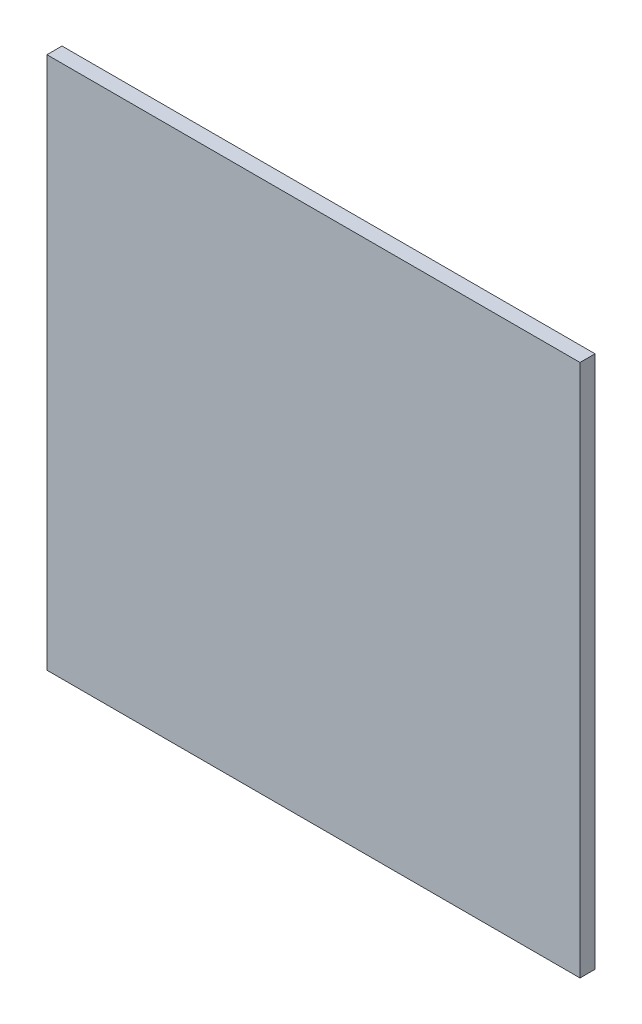
ISO-10303-21;
HEADER;
FILE_DESCRIPTION(('STEP AP214'),'2;1');
FILE_NAME('part.step','',(''),(''),'','','');
FILE_SCHEMA(('AUTOMOTIVE_DESIGN { 1 0 10303 214 1 1 1 1 }'));
ENDSEC;
DATA;
#1=APPLICATION_CONTEXT('core data for automotive mechanical design processes');
#2=APPLICATION_PROTOCOL_DEFINITION('international standard','automotive_design',2000,#1);
#3=PRODUCT_CONTEXT('',#1,'mechanical');
#4=PRODUCT('Part','Part','',(#3));
#5=PRODUCT_RELATED_PRODUCT_CATEGORY('part','',(#4));
#6=PRODUCT_DEFINITION_FORMATION('','',#4);
#7=PRODUCT_DEFINITION_CONTEXT('part definition',#1,'design');
#8=PRODUCT_DEFINITION('design','',#6,#7);
#9=PRODUCT_DEFINITION_SHAPE('','',#8);
#10=(LENGTH_UNIT() NAMED_UNIT(*) SI_UNIT(.MILLI.,.METRE.));
#11=(NAMED_UNIT(*) PLANE_ANGLE_UNIT() SI_UNIT($,.RADIAN.));
#12=(NAMED_UNIT(*) SI_UNIT($,.STERADIAN.) SOLID_ANGLE_UNIT());
#13=UNCERTAINTY_MEASURE_WITH_UNIT(LENGTH_MEASURE(1.E-05),#10,'distance_accuracy_value','');
#14=(GEOMETRIC_REPRESENTATION_CONTEXT(3) GLOBAL_UNCERTAINTY_ASSIGNED_CONTEXT((#13)) GLOBAL_UNIT_ASSIGNED_CONTEXT((#10,
#11,#12)) REPRESENTATION_CONTEXT('',''));
#15=CARTESIAN_POINT('',(0.,0.,0.));
#16=DIRECTION('',(0.,0.,1.));
#17=DIRECTION('',(1.,0.,0.));
#18=AXIS2_PLACEMENT_3D('',#15,#16,#17);
#19=CARTESIAN_POINT('',(-177.,177.,10.));
#20=DIRECTION('',(1.,0.,0.));
#21=DIRECTION('',(0.,1.,0.));
#22=AXIS2_PLACEMENT_3D('',#19,#20,#21);
#23=PLANE('',#22);
#24=DIRECTION('',(0.,-1.,0.));
#25=VECTOR('',#24,1.);
#26=CARTESIAN_POINT('',(-177.,177.,0.));
#27=LINE('',#26,#25);
#28=CARTESIAN_POINT('',(-177.,177.,0.));
#29=VERTEX_POINT('',#28);
#30=CARTESIAN_POINT('',(-177.,-177.,0.));
#31=VERTEX_POINT('',#30);
#32=EDGE_CURVE('E94',#29,#31,#27,.T.);
#33=ORIENTED_EDGE('',*,*,#32,.T.);
#34=DIRECTION('',(0.,0.,-1.));
#35=VECTOR('',#34,1.);
#36=CARTESIAN_POINT('',(-177.,-177.,10.));
#37=LINE('',#36,#35);
#38=CARTESIAN_POINT('',(-177.,-177.,10.));
#39=VERTEX_POINT('',#38);
#40=EDGE_CURVE('E11',#39,#31,#37,.T.);
#41=ORIENTED_EDGE('',*,*,#40,.F.);
#42=DIRECTION('',(0.,-1.,0.));
#43=VECTOR('',#42,1.);
#44=CARTESIAN_POINT('',(-177.,177.,10.));
#45=LINE('',#44,#43);
#46=CARTESIAN_POINT('',(-177.,177.,10.));
#47=VERTEX_POINT('',#46);
#48=EDGE_CURVE('E82',#47,#39,#45,.T.);
#49=ORIENTED_EDGE('',*,*,#48,.F.);
#50=DIRECTION('',(0.,0.,-1.));
#51=VECTOR('',#50,1.);
#52=CARTESIAN_POINT('',(-177.,177.,10.));
#53=LINE('',#52,#51);
#54=EDGE_CURVE('E90',#47,#29,#53,.T.);
#55=ORIENTED_EDGE('',*,*,#54,.T.);
#56=EDGE_LOOP('',(#33,#41,#49,#55));
#57=FACE_BOUND('',#56,.T.);
#58=ADVANCED_FACE('F31',(#57),#23,.F.);
#59=CARTESIAN_POINT('',(-177.,-177.,10.));
#60=DIRECTION('',(0.,1.,0.));
#61=DIRECTION('',(0.,0.,1.));
#62=AXIS2_PLACEMENT_3D('',#59,#60,#61);
#63=PLANE('',#62);
#64=DIRECTION('',(1.,0.,0.));
#65=VECTOR('',#64,1.);
#66=CARTESIAN_POINT('',(-177.,-177.,0.));
#67=LINE('',#66,#65);
#68=CARTESIAN_POINT('',(177.,-177.,0.));
#69=VERTEX_POINT('',#68);
#70=EDGE_CURVE('E86',#31,#69,#67,.T.);
#71=ORIENTED_EDGE('',*,*,#70,.T.);
#72=DIRECTION('',(0.,0.,-1.));
#73=VECTOR('',#72,1.);
#74=CARTESIAN_POINT('',(177.,-177.,10.));
#75=LINE('',#74,#73);
#76=CARTESIAN_POINT('',(177.,-177.,10.));
#77=VERTEX_POINT('',#76);
#78=EDGE_CURVE('E39',#77,#69,#75,.T.);
#79=ORIENTED_EDGE('',*,*,#78,.F.);
#80=DIRECTION('',(1.,0.,0.));
#81=VECTOR('',#80,1.);
#82=CARTESIAN_POINT('',(-177.,-177.,10.));
#83=LINE('',#82,#81);
#84=EDGE_CURVE('E77',#39,#77,#83,.T.);
#85=ORIENTED_EDGE('',*,*,#84,.F.);
#86=ORIENTED_EDGE('',*,*,#40,.T.);
#87=EDGE_LOOP('',(#71,#79,#85,#86));
#88=FACE_BOUND('',#87,.T.);
#89=ADVANCED_FACE('F85',(#88),#63,.F.);
#90=CARTESIAN_POINT('',(177.,177.,10.));
#91=DIRECTION('',(-1.,0.,0.));
#92=DIRECTION('',(0.,-1.,0.));
#93=AXIS2_PLACEMENT_3D('',#90,#91,#92);
#94=PLANE('',#93);
#95=DIRECTION('',(0.,1.,0.));
#96=VECTOR('',#95,1.);
#97=CARTESIAN_POINT('',(177.,177.,0.));
#98=LINE('',#97,#96);
#99=CARTESIAN_POINT('',(177.,177.,0.));
#100=VERTEX_POINT('',#99);
#101=EDGE_CURVE('E64',#69,#100,#98,.T.);
#102=ORIENTED_EDGE('',*,*,#101,.T.);
#103=DIRECTION('',(0.,0.,-1.));
#104=VECTOR('',#103,1.);
#105=CARTESIAN_POINT('',(177.,177.,10.));
#106=LINE('',#105,#104);
#107=CARTESIAN_POINT('',(177.,177.,10.));
#108=VERTEX_POINT('',#107);
#109=EDGE_CURVE('E87',#108,#100,#106,.T.);
#110=ORIENTED_EDGE('',*,*,#109,.F.);
#111=DIRECTION('',(0.,1.,0.));
#112=VECTOR('',#111,1.);
#113=CARTESIAN_POINT('',(177.,177.,10.));
#114=LINE('',#113,#112);
#115=EDGE_CURVE('E80',#77,#108,#114,.T.);
#116=ORIENTED_EDGE('',*,*,#115,.F.);
#117=ORIENTED_EDGE('',*,*,#78,.T.);
#118=EDGE_LOOP('',(#102,#110,#116,#117));
#119=FACE_BOUND('',#118,.T.);
#120=ADVANCED_FACE('F88',(#119),#94,.F.);
#121=CARTESIAN_POINT('',(-177.,177.,10.));
#122=DIRECTION('',(0.,-1.,0.));
#123=DIRECTION('',(0.,0.,-1.));
#124=AXIS2_PLACEMENT_3D('',#121,#122,#123);
#125=PLANE('',#124);
#126=DIRECTION('',(-1.,0.,0.));
#127=VECTOR('',#126,1.);
#128=CARTESIAN_POINT('',(-177.,177.,0.));
#129=LINE('',#128,#127);
#130=EDGE_CURVE('E70',#100,#29,#129,.T.);
#131=ORIENTED_EDGE('',*,*,#130,.T.);
#132=ORIENTED_EDGE('',*,*,#54,.F.);
#133=DIRECTION('',(-1.,0.,0.));
#134=VECTOR('',#133,1.);
#135=CARTESIAN_POINT('',(-177.,177.,10.));
#136=LINE('',#135,#134);
#137=EDGE_CURVE('E47',#108,#47,#136,.T.);
#138=ORIENTED_EDGE('',*,*,#137,.F.);
#139=ORIENTED_EDGE('',*,*,#109,.T.);
#140=EDGE_LOOP('',(#131,#132,#138,#139));
#141=FACE_BOUND('',#140,.T.);
#142=ADVANCED_FACE('F101',(#141),#125,.F.);
#143=CARTESIAN_POINT('',(-177.,-177.,10.));
#144=DIRECTION('',(0.,0.,1.));
#145=DIRECTION('',(1.,0.,0.));
#146=AXIS2_PLACEMENT_3D('',#143,#144,#145);
#147=PLANE('',#146);
#148=ORIENTED_EDGE('',*,*,#48,.T.);
#149=ORIENTED_EDGE('',*,*,#84,.T.);
#150=ORIENTED_EDGE('',*,*,#115,.T.);
#151=ORIENTED_EDGE('',*,*,#137,.T.);
#152=EDGE_LOOP('',(#148,#149,#150,#151));
#153=FACE_BOUND('',#152,.T.);
#154=ADVANCED_FACE('F78',(#153),#147,.T.);
#155=CARTESIAN_POINT('',(-177.,-177.,0.));
#156=DIRECTION('',(0.,0.,1.));
#157=DIRECTION('',(1.,0.,0.));
#158=AXIS2_PLACEMENT_3D('',#155,#156,#157);
#159=PLANE('',#158);
#160=ORIENTED_EDGE('',*,*,#32,.F.);
#161=ORIENTED_EDGE('',*,*,#130,.F.);
#162=ORIENTED_EDGE('',*,*,#101,.F.);
#163=ORIENTED_EDGE('',*,*,#70,.F.);
#164=EDGE_LOOP('',(#160,#161,#162,#163));
#165=FACE_BOUND('',#164,.T.);
#166=ADVANCED_FACE('F104',(#165),#159,.F.);
#167=CLOSED_SHELL('',(#58,#89,#120,#142,#154,#166));
#168=MANIFOLD_SOLID_BREP('B2',#167);
#169=ADVANCED_BREP_SHAPE_REPRESENTATION('',(#18,#168),#14);
#170=SHAPE_DEFINITION_REPRESENTATION(#9,#169);
ENDSEC;
END-ISO-10303-21;
